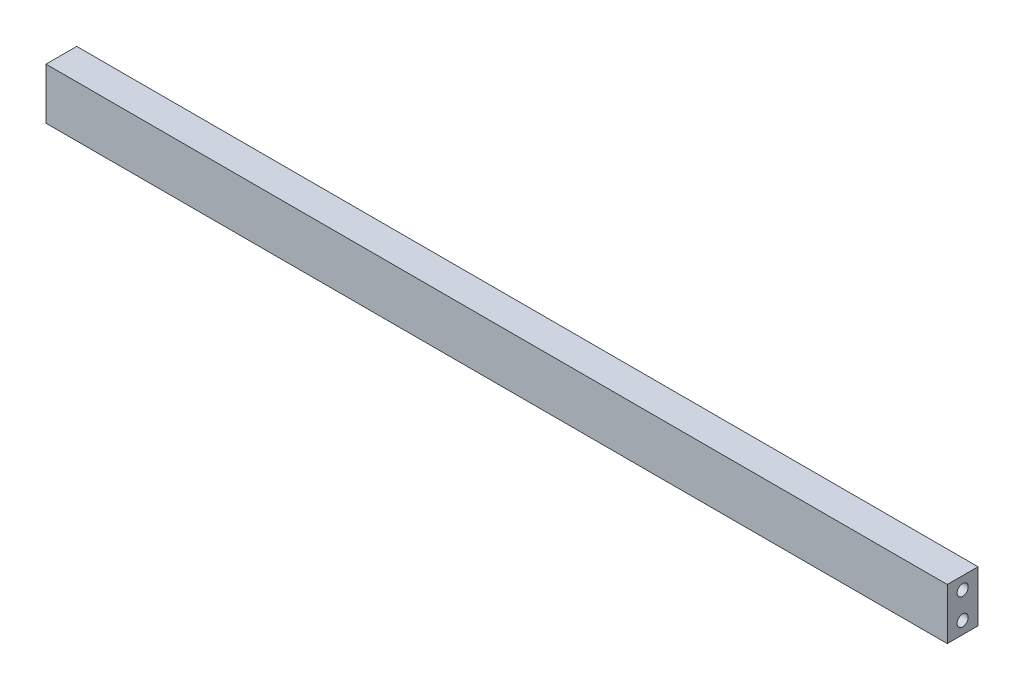
ISO-10303-21;
HEADER;
FILE_DESCRIPTION(('STEP AP214'),'2;1');
FILE_NAME('part.step','',(''),(''),'','','');
FILE_SCHEMA(('AUTOMOTIVE_DESIGN { 1 0 10303 214 1 1 1 1 }'));
ENDSEC;
DATA;
#1=APPLICATION_CONTEXT('core data for automotive mechanical design processes');
#2=APPLICATION_PROTOCOL_DEFINITION('international standard','automotive_design',2000,#1);
#3=PRODUCT_CONTEXT('',#1,'mechanical');
#4=PRODUCT('Part','Part','',(#3));
#5=PRODUCT_RELATED_PRODUCT_CATEGORY('part','',(#4));
#6=PRODUCT_DEFINITION_FORMATION('','',#4);
#7=PRODUCT_DEFINITION_CONTEXT('part definition',#1,'design');
#8=PRODUCT_DEFINITION('design','',#6,#7);
#9=PRODUCT_DEFINITION_SHAPE('','',#8);
#10=(LENGTH_UNIT() NAMED_UNIT(*) SI_UNIT(.MILLI.,.METRE.));
#11=(NAMED_UNIT(*) PLANE_ANGLE_UNIT() SI_UNIT($,.RADIAN.));
#12=(NAMED_UNIT(*) SI_UNIT($,.STERADIAN.) SOLID_ANGLE_UNIT());
#13=UNCERTAINTY_MEASURE_WITH_UNIT(LENGTH_MEASURE(1.E-05),#10,'distance_accuracy_value','');
#14=(GEOMETRIC_REPRESENTATION_CONTEXT(3) GLOBAL_UNCERTAINTY_ASSIGNED_CONTEXT((#13)) GLOBAL_UNIT_ASSIGNED_CONTEXT((#10,
#11,#12)) REPRESENTATION_CONTEXT('',''));
#15=CARTESIAN_POINT('',(0.,0.,0.));
#16=DIRECTION('',(0.,0.,1.));
#17=DIRECTION('',(1.,0.,0.));
#18=AXIS2_PLACEMENT_3D('',#15,#16,#17);
#19=CARTESIAN_POINT('',(139.7,7.9375,-4.7625));
#20=DIRECTION('',(0.,0.,1.));
#21=DIRECTION('',(0.,-1.,0.));
#22=AXIS2_PLACEMENT_3D('',#19,#20,#21);
#23=PLANE('',#22);
#24=DIRECTION('',(0.,1.,0.));
#25=VECTOR('',#24,1.);
#26=CARTESIAN_POINT('',(-139.7,7.9375,-4.7625));
#27=LINE('',#26,#25);
#28=CARTESIAN_POINT('',(-139.7,-7.9375,-4.7625));
#29=VERTEX_POINT('',#28);
#30=CARTESIAN_POINT('',(-139.7,7.9375,-4.7625));
#31=VERTEX_POINT('',#30);
#32=EDGE_CURVE('E145',#29,#31,#27,.T.);
#33=ORIENTED_EDGE('',*,*,#32,.T.);
#34=DIRECTION('',(-1.,0.,0.));
#35=VECTOR('',#34,1.);
#36=CARTESIAN_POINT('',(139.7,7.9375,-4.7625));
#37=LINE('',#36,#35);
#38=CARTESIAN_POINT('',(139.7,7.9375,-4.7625));
#39=VERTEX_POINT('',#38);
#40=EDGE_CURVE('E11',#39,#31,#37,.T.);
#41=ORIENTED_EDGE('',*,*,#40,.F.);
#42=DIRECTION('',(0.,1.,0.));
#43=VECTOR('',#42,1.);
#44=CARTESIAN_POINT('',(139.7,7.9375,-4.7625));
#45=LINE('',#44,#43);
#46=CARTESIAN_POINT('',(139.7,-7.9375,-4.7625));
#47=VERTEX_POINT('',#46);
#48=EDGE_CURVE('E146',#47,#39,#45,.T.);
#49=ORIENTED_EDGE('',*,*,#48,.F.);
#50=DIRECTION('',(-1.,0.,0.));
#51=VECTOR('',#50,1.);
#52=CARTESIAN_POINT('',(139.7,-7.9375,-4.7625));
#53=LINE('',#52,#51);
#54=EDGE_CURVE('E156',#47,#29,#53,.T.);
#55=ORIENTED_EDGE('',*,*,#54,.T.);
#56=EDGE_LOOP('',(#33,#41,#49,#55));
#57=FACE_BOUND('',#56,.T.);
#58=ADVANCED_FACE('F43',(#57),#23,.F.);
#59=CARTESIAN_POINT('',(139.7,7.9375,4.7625));
#60=DIRECTION('',(0.,-1.,0.));
#61=DIRECTION('',(0.,0.,-1.));
#62=AXIS2_PLACEMENT_3D('',#59,#60,#61);
#63=PLANE('',#62);
#64=DIRECTION('',(0.,0.,1.));
#65=VECTOR('',#64,1.);
#66=CARTESIAN_POINT('',(-139.7,7.9375,4.7625));
#67=LINE('',#66,#65);
#68=CARTESIAN_POINT('',(-139.7,7.9375,4.7625));
#69=VERTEX_POINT('',#68);
#70=EDGE_CURVE('E160',#31,#69,#67,.T.);
#71=ORIENTED_EDGE('',*,*,#70,.T.);
#72=DIRECTION('',(-1.,0.,0.));
#73=VECTOR('',#72,1.);
#74=CARTESIAN_POINT('',(139.7,7.9375,4.7625));
#75=LINE('',#74,#73);
#76=CARTESIAN_POINT('',(139.7,7.9375,4.7625));
#77=VERTEX_POINT('',#76);
#78=EDGE_CURVE('E52',#77,#69,#75,.T.);
#79=ORIENTED_EDGE('',*,*,#78,.F.);
#80=DIRECTION('',(0.,0.,1.));
#81=VECTOR('',#80,1.);
#82=CARTESIAN_POINT('',(139.7,7.9375,4.7625));
#83=LINE('',#82,#81);
#84=EDGE_CURVE('E91',#39,#77,#83,.T.);
#85=ORIENTED_EDGE('',*,*,#84,.F.);
#86=ORIENTED_EDGE('',*,*,#40,.T.);
#87=EDGE_LOOP('',(#71,#79,#85,#86));
#88=FACE_BOUND('',#87,.T.);
#89=ADVANCED_FACE('F190',(#88),#63,.F.);
#90=CARTESIAN_POINT('',(139.7,7.9375,4.7625));
#91=DIRECTION('',(0.,0.,-1.));
#92=DIRECTION('',(0.,1.,0.));
#93=AXIS2_PLACEMENT_3D('',#90,#91,#92);
#94=PLANE('',#93);
#95=DIRECTION('',(0.,-1.,0.));
#96=VECTOR('',#95,1.);
#97=CARTESIAN_POINT('',(-139.7,7.9375,4.7625));
#98=LINE('',#97,#96);
#99=CARTESIAN_POINT('',(-139.7,-7.9375,4.7625));
#100=VERTEX_POINT('',#99);
#101=EDGE_CURVE('E78',#69,#100,#98,.T.);
#102=ORIENTED_EDGE('',*,*,#101,.T.);
#103=DIRECTION('',(-1.,0.,0.));
#104=VECTOR('',#103,1.);
#105=CARTESIAN_POINT('',(139.7,-7.9375,4.7625));
#106=LINE('',#105,#104);
#107=CARTESIAN_POINT('',(139.7,-7.9375,4.7625));
#108=VERTEX_POINT('',#107);
#109=EDGE_CURVE('E169',#108,#100,#106,.T.);
#110=ORIENTED_EDGE('',*,*,#109,.F.);
#111=DIRECTION('',(0.,-1.,0.));
#112=VECTOR('',#111,1.);
#113=CARTESIAN_POINT('',(139.7,7.9375,4.7625));
#114=LINE('',#113,#112);
#115=EDGE_CURVE('E151',#77,#108,#114,.T.);
#116=ORIENTED_EDGE('',*,*,#115,.F.);
#117=ORIENTED_EDGE('',*,*,#78,.T.);
#118=EDGE_LOOP('',(#102,#110,#116,#117));
#119=FACE_BOUND('',#118,.T.);
#120=ADVANCED_FACE('F173',(#119),#94,.F.);
#121=CARTESIAN_POINT('',(139.7,-7.9375,4.7625));
#122=DIRECTION('',(0.,1.,0.));
#123=DIRECTION('',(0.,0.,1.));
#124=AXIS2_PLACEMENT_3D('',#121,#122,#123);
#125=PLANE('',#124);
#126=DIRECTION('',(0.,0.,-1.));
#127=VECTOR('',#126,1.);
#128=CARTESIAN_POINT('',(-139.7,-7.9375,4.7625));
#129=LINE('',#128,#127);
#130=EDGE_CURVE('E84',#100,#29,#129,.T.);
#131=ORIENTED_EDGE('',*,*,#130,.T.);
#132=ORIENTED_EDGE('',*,*,#54,.F.);
#133=DIRECTION('',(0.,0.,-1.));
#134=VECTOR('',#133,1.);
#135=CARTESIAN_POINT('',(139.7,-7.9375,4.7625));
#136=LINE('',#135,#134);
#137=EDGE_CURVE('E60',#108,#47,#136,.T.);
#138=ORIENTED_EDGE('',*,*,#137,.F.);
#139=ORIENTED_EDGE('',*,*,#109,.T.);
#140=EDGE_LOOP('',(#131,#132,#138,#139));
#141=FACE_BOUND('',#140,.T.);
#142=ADVANCED_FACE('F180',(#141),#125,.F.);
#143=CARTESIAN_POINT('',(139.7,0.,0.));
#144=DIRECTION('',(1.,0.,0.));
#145=DIRECTION('',(0.,0.,-1.));
#146=AXIS2_PLACEMENT_3D('',#143,#144,#145);
#147=PLANE('',#146);
#148=CARTESIAN_POINT('',(139.7,4.0894,0.));
#149=DIRECTION('',(1.,0.,0.));
#150=DIRECTION('',(0.,0.,-1.));
#151=AXIS2_PLACEMENT_3D('',#148,#149,#150);
#152=CIRCLE('',#151,1.7272);
#153=CARTESIAN_POINT('',(139.7,4.0894,-1.7272));
#154=VERTEX_POINT('',#153);
#155=EDGE_CURVE('E129',#154,#154,#152,.T.);
#156=ORIENTED_EDGE('',*,*,#155,.F.);
#157=EDGE_LOOP('',(#156));
#158=FACE_BOUND('',#157,.T.);
#159=CARTESIAN_POINT('',(139.7,-4.0894,0.));
#160=DIRECTION('',(1.,0.,0.));
#161=DIRECTION('',(0.,0.,-1.));
#162=AXIS2_PLACEMENT_3D('',#159,#160,#161);
#163=CIRCLE('',#162,1.7272);
#164=CARTESIAN_POINT('',(139.7,-4.0894,-1.7272));
#165=VERTEX_POINT('',#164);
#166=EDGE_CURVE('E137',#165,#165,#163,.T.);
#167=ORIENTED_EDGE('',*,*,#166,.F.);
#168=EDGE_LOOP('',(#167));
#169=FACE_BOUND('',#168,.T.);
#170=ORIENTED_EDGE('',*,*,#48,.T.);
#171=ORIENTED_EDGE('',*,*,#84,.T.);
#172=ORIENTED_EDGE('',*,*,#115,.T.);
#173=ORIENTED_EDGE('',*,*,#137,.T.);
#174=EDGE_LOOP('',(#170,#171,#172,#173));
#175=FACE_BOUND('',#174,.T.);
#176=ADVANCED_FACE('F182',(#158,#169,#175),#147,.T.);
#177=CARTESIAN_POINT('',(-139.7,0.,0.));
#178=DIRECTION('',(1.,0.,0.));
#179=DIRECTION('',(0.,0.,-1.));
#180=AXIS2_PLACEMENT_3D('',#177,#178,#179);
#181=PLANE('',#180);
#182=CARTESIAN_POINT('',(-139.7,4.0894,0.));
#183=DIRECTION('',(-1.,0.,0.));
#184=DIRECTION('',(0.,0.,1.));
#185=AXIS2_PLACEMENT_3D('',#182,#183,#184);
#186=CIRCLE('',#185,1.7272);
#187=CARTESIAN_POINT('',(-139.7,4.0894,1.7272));
#188=VERTEX_POINT('',#187);
#189=EDGE_CURVE('E116',#188,#188,#186,.T.);
#190=ORIENTED_EDGE('',*,*,#189,.F.);
#191=EDGE_LOOP('',(#190));
#192=FACE_BOUND('',#191,.T.);
#193=CARTESIAN_POINT('',(-139.7,-4.0894,0.));
#194=DIRECTION('',(-1.,0.,0.));
#195=DIRECTION('',(0.,0.,1.));
#196=AXIS2_PLACEMENT_3D('',#193,#194,#195);
#197=CIRCLE('',#196,1.7272);
#198=CARTESIAN_POINT('',(-139.7,-4.0894,1.7272));
#199=VERTEX_POINT('',#198);
#200=EDGE_CURVE('E115',#199,#199,#197,.T.);
#201=ORIENTED_EDGE('',*,*,#200,.F.);
#202=EDGE_LOOP('',(#201));
#203=FACE_BOUND('',#202,.T.);
#204=ORIENTED_EDGE('',*,*,#32,.F.);
#205=ORIENTED_EDGE('',*,*,#130,.F.);
#206=ORIENTED_EDGE('',*,*,#101,.F.);
#207=ORIENTED_EDGE('',*,*,#70,.F.);
#208=EDGE_LOOP('',(#204,#205,#206,#207));
#209=FACE_BOUND('',#208,.T.);
#210=ADVANCED_FACE('F176',(#192,#203,#209),#181,.F.);
#211=CARTESIAN_POINT('',(129.54,-4.0894,0.));
#212=DIRECTION('',(1.,0.,0.));
#213=DIRECTION('',(0.,0.,-1.));
#214=AXIS2_PLACEMENT_3D('',#211,#212,#213);
#215=CONICAL_SURFACE('',#214,1.7272,1.02974425867665);
#216=CARTESIAN_POINT('',(128.502193538816,-4.0894,0.));
#217=VERTEX_POINT('',#216);
#218=VERTEX_LOOP('',#217);
#219=FACE_BOUND('',#218,.T.);
#220=CARTESIAN_POINT('',(129.54,-4.0894,0.));
#221=DIRECTION('',(1.,0.,0.));
#222=DIRECTION('',(0.,0.,-1.));
#223=AXIS2_PLACEMENT_3D('',#220,#221,#222);
#224=CIRCLE('',#223,1.7272);
#225=CARTESIAN_POINT('',(129.54,-4.0894,-1.7272));
#226=VERTEX_POINT('',#225);
#227=EDGE_CURVE('E141',#226,#226,#224,.T.);
#228=ORIENTED_EDGE('',*,*,#227,.T.);
#229=EDGE_LOOP('',(#228));
#230=FACE_BOUND('',#229,.T.);
#231=ADVANCED_FACE('F223',(#219,#230),#215,.F.);
#232=CARTESIAN_POINT('',(139.7,-4.0894,0.));
#233=DIRECTION('',(1.,0.,0.));
#234=DIRECTION('',(0.,0.,-1.));
#235=AXIS2_PLACEMENT_3D('',#232,#233,#234);
#236=CYLINDRICAL_SURFACE('',#235,1.7272);
#237=ORIENTED_EDGE('',*,*,#227,.F.);
#238=EDGE_LOOP('',(#237));
#239=FACE_BOUND('',#238,.T.);
#240=ORIENTED_EDGE('',*,*,#166,.T.);
#241=EDGE_LOOP('',(#240));
#242=FACE_BOUND('',#241,.T.);
#243=ADVANCED_FACE('F228',(#239,#242),#236,.F.);
#244=CARTESIAN_POINT('',(129.54,4.0894,0.));
#245=DIRECTION('',(1.,0.,0.));
#246=DIRECTION('',(0.,0.,-1.));
#247=AXIS2_PLACEMENT_3D('',#244,#245,#246);
#248=CONICAL_SURFACE('',#247,1.7272,1.02974425867665);
#249=CARTESIAN_POINT('',(128.502193538816,4.0894,0.));
#250=VERTEX_POINT('',#249);
#251=VERTEX_LOOP('',#250);
#252=FACE_BOUND('',#251,.T.);
#253=CARTESIAN_POINT('',(129.54,4.0894,0.));
#254=DIRECTION('',(1.,0.,0.));
#255=DIRECTION('',(0.,0.,-1.));
#256=AXIS2_PLACEMENT_3D('',#253,#254,#255);
#257=CIRCLE('',#256,1.7272);
#258=CARTESIAN_POINT('',(129.54,4.0894,-1.7272));
#259=VERTEX_POINT('',#258);
#260=EDGE_CURVE('E133',#259,#259,#257,.T.);
#261=ORIENTED_EDGE('',*,*,#260,.T.);
#262=EDGE_LOOP('',(#261));
#263=FACE_BOUND('',#262,.T.);
#264=ADVANCED_FACE('F239',(#252,#263),#248,.F.);
#265=CARTESIAN_POINT('',(139.7,4.0894,0.));
#266=DIRECTION('',(1.,0.,0.));
#267=DIRECTION('',(0.,0.,-1.));
#268=AXIS2_PLACEMENT_3D('',#265,#266,#267);
#269=CYLINDRICAL_SURFACE('',#268,1.7272);
#270=ORIENTED_EDGE('',*,*,#260,.F.);
#271=EDGE_LOOP('',(#270));
#272=FACE_BOUND('',#271,.T.);
#273=ORIENTED_EDGE('',*,*,#155,.T.);
#274=EDGE_LOOP('',(#273));
#275=FACE_BOUND('',#274,.T.);
#276=ADVANCED_FACE('F250',(#272,#275),#269,.F.);
#277=CARTESIAN_POINT('',(-129.54,-4.0894,0.));
#278=DIRECTION('',(-1.,0.,0.));
#279=DIRECTION('',(0.,0.,1.));
#280=AXIS2_PLACEMENT_3D('',#277,#278,#279);
#281=CONICAL_SURFACE('',#280,1.7272,1.02974425867665);
#282=CARTESIAN_POINT('',(-128.502193538816,-4.0894,0.));
#283=VERTEX_POINT('',#282);
#284=VERTEX_LOOP('',#283);
#285=FACE_BOUND('',#284,.T.);
#286=CARTESIAN_POINT('',(-129.54,-4.0894,0.));
#287=DIRECTION('',(-1.,0.,0.));
#288=DIRECTION('',(0.,0.,1.));
#289=AXIS2_PLACEMENT_3D('',#286,#287,#288);
#290=CIRCLE('',#289,1.7272);
#291=CARTESIAN_POINT('',(-129.54,-4.0894,1.7272));
#292=VERTEX_POINT('',#291);
#293=EDGE_CURVE('E121',#292,#292,#290,.T.);
#294=ORIENTED_EDGE('',*,*,#293,.T.);
#295=EDGE_LOOP('',(#294));
#296=FACE_BOUND('',#295,.T.);
#297=ADVANCED_FACE('F261',(#285,#296),#281,.F.);
#298=CARTESIAN_POINT('',(-139.7,-4.0894,0.));
#299=DIRECTION('',(-1.,0.,0.));
#300=DIRECTION('',(0.,0.,1.));
#301=AXIS2_PLACEMENT_3D('',#298,#299,#300);
#302=CYLINDRICAL_SURFACE('',#301,1.7272);
#303=ORIENTED_EDGE('',*,*,#293,.F.);
#304=EDGE_LOOP('',(#303));
#305=FACE_BOUND('',#304,.T.);
#306=ORIENTED_EDGE('',*,*,#200,.T.);
#307=EDGE_LOOP('',(#306));
#308=FACE_BOUND('',#307,.T.);
#309=ADVANCED_FACE('F108',(#305,#308),#302,.F.);
#310=CARTESIAN_POINT('',(-129.54,4.0894,0.));
#311=DIRECTION('',(-1.,0.,0.));
#312=DIRECTION('',(0.,0.,1.));
#313=AXIS2_PLACEMENT_3D('',#310,#311,#312);
#314=CONICAL_SURFACE('',#313,1.7272,1.02974425867665);
#315=CARTESIAN_POINT('',(-128.502193538816,4.0894,0.));
#316=VERTEX_POINT('',#315);
#317=VERTEX_LOOP('',#316);
#318=FACE_BOUND('',#317,.T.);
#319=CARTESIAN_POINT('',(-129.54,4.0894,0.));
#320=DIRECTION('',(-1.,0.,0.));
#321=DIRECTION('',(0.,0.,1.));
#322=AXIS2_PLACEMENT_3D('',#319,#320,#321);
#323=CIRCLE('',#322,1.7272);
#324=CARTESIAN_POINT('',(-129.54,4.0894,1.7272));
#325=VERTEX_POINT('',#324);
#326=EDGE_CURVE('E112',#325,#325,#323,.T.);
#327=ORIENTED_EDGE('',*,*,#326,.T.);
#328=EDGE_LOOP('',(#327));
#329=FACE_BOUND('',#328,.T.);
#330=ADVANCED_FACE('F104',(#318,#329),#314,.F.);
#331=CARTESIAN_POINT('',(-139.7,4.0894,0.));
#332=DIRECTION('',(-1.,0.,0.));
#333=DIRECTION('',(0.,0.,1.));
#334=AXIS2_PLACEMENT_3D('',#331,#332,#333);
#335=CYLINDRICAL_SURFACE('',#334,1.7272);
#336=ORIENTED_EDGE('',*,*,#326,.F.);
#337=EDGE_LOOP('',(#336));
#338=FACE_BOUND('',#337,.T.);
#339=ORIENTED_EDGE('',*,*,#189,.T.);
#340=EDGE_LOOP('',(#339));
#341=FACE_BOUND('',#340,.T.);
#342=ADVANCED_FACE('F107',(#338,#341),#335,.F.);
#343=CLOSED_SHELL('',(#58,#89,#120,#142,#176,#210,#231,#243,#264,#276,#297,#309,#330,#342));
#344=MANIFOLD_SOLID_BREP('B2',#343);
#345=ADVANCED_BREP_SHAPE_REPRESENTATION('',(#18,#344),#14);
#346=SHAPE_DEFINITION_REPRESENTATION(#9,#345);
ENDSEC;
END-ISO-10303-21;
